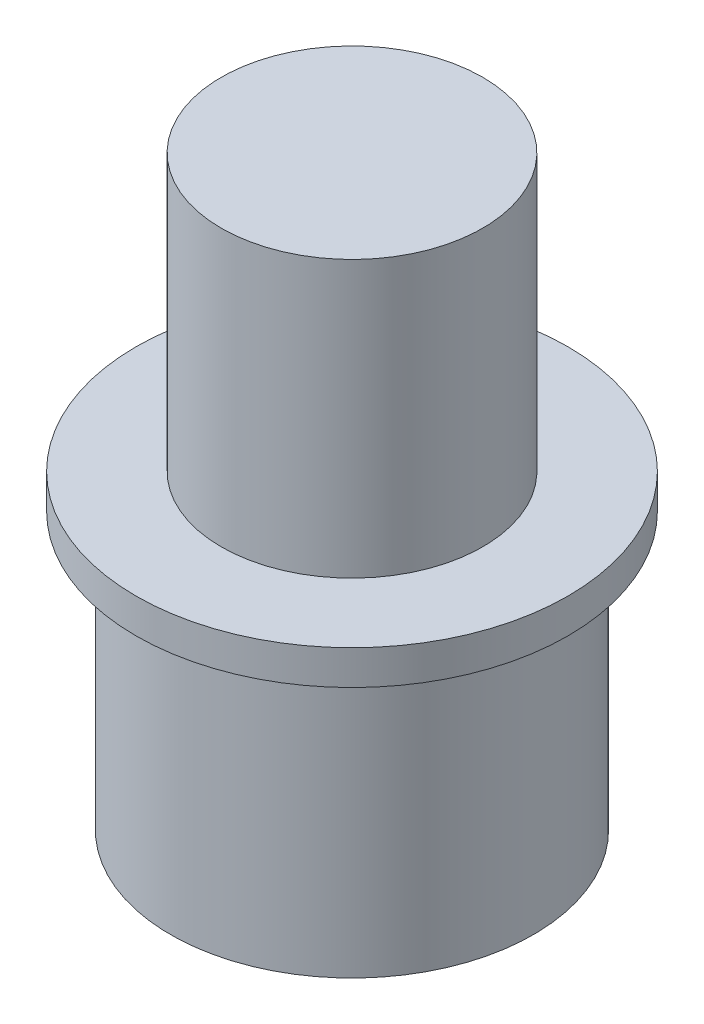
ISO-10303-21;
HEADER;
FILE_DESCRIPTION(('STEP AP214'),'2;1');
FILE_NAME('part.step','',(''),(''),'','','');
FILE_SCHEMA(('AUTOMOTIVE_DESIGN { 1 0 10303 214 1 1 1 1 }'));
ENDSEC;
DATA;
#1=APPLICATION_CONTEXT('core data for automotive mechanical design processes');
#2=APPLICATION_PROTOCOL_DEFINITION('international standard','automotive_design',2000,#1);
#3=PRODUCT_CONTEXT('',#1,'mechanical');
#4=PRODUCT('Part','Part','',(#3));
#5=PRODUCT_RELATED_PRODUCT_CATEGORY('part','',(#4));
#6=PRODUCT_DEFINITION_FORMATION('','',#4);
#7=PRODUCT_DEFINITION_CONTEXT('part definition',#1,'design');
#8=PRODUCT_DEFINITION('design','',#6,#7);
#9=PRODUCT_DEFINITION_SHAPE('','',#8);
#10=(LENGTH_UNIT() NAMED_UNIT(*) SI_UNIT(.MILLI.,.METRE.));
#11=(NAMED_UNIT(*) PLANE_ANGLE_UNIT() SI_UNIT($,.RADIAN.));
#12=(NAMED_UNIT(*) SI_UNIT($,.STERADIAN.) SOLID_ANGLE_UNIT());
#13=UNCERTAINTY_MEASURE_WITH_UNIT(LENGTH_MEASURE(1.E-05),#10,'distance_accuracy_value','');
#14=(GEOMETRIC_REPRESENTATION_CONTEXT(3) GLOBAL_UNCERTAINTY_ASSIGNED_CONTEXT((#13)) GLOBAL_UNIT_ASSIGNED_CONTEXT((#10,
#11,#12)) REPRESENTATION_CONTEXT('',''));
#15=CARTESIAN_POINT('',(0.,0.,0.));
#16=DIRECTION('',(0.,0.,1.));
#17=DIRECTION('',(1.,0.,0.));
#18=AXIS2_PLACEMENT_3D('',#15,#16,#17);
#19=CARTESIAN_POINT('',(0.,0.,0.));
#20=DIRECTION('',(0.,-1.,0.));
#21=DIRECTION('',(0.,0.,-1.));
#22=AXIS2_PLACEMENT_3D('',#19,#20,#21);
#23=CYLINDRICAL_SURFACE('',#22,3.175);
#24=CARTESIAN_POINT('',(0.,8.89,0.));
#25=DIRECTION('',(0.,-1.,0.));
#26=DIRECTION('',(0.,0.,-1.));
#27=AXIS2_PLACEMENT_3D('',#24,#25,#26);
#28=CIRCLE('',#27,3.175);
#29=CARTESIAN_POINT('',(0.,8.89,-3.175));
#30=VERTEX_POINT('',#29);
#31=EDGE_CURVE('E65',#30,#30,#28,.T.);
#32=ORIENTED_EDGE('',*,*,#31,.F.);
#33=EDGE_LOOP('',(#32));
#34=FACE_BOUND('',#33,.T.);
#35=CARTESIAN_POINT('',(0.,0.,0.));
#36=DIRECTION('',(0.,-1.,0.));
#37=DIRECTION('',(0.,0.,-1.));
#38=AXIS2_PLACEMENT_3D('',#35,#36,#37);
#39=CIRCLE('',#38,3.175);
#40=CARTESIAN_POINT('',(0.,0.,-3.175));
#41=VERTEX_POINT('',#40);
#42=EDGE_CURVE('E10',#41,#41,#39,.T.);
#43=ORIENTED_EDGE('',*,*,#42,.T.);
#44=EDGE_LOOP('',(#43));
#45=FACE_BOUND('',#44,.T.);
#46=ADVANCED_FACE('F37',(#34,#45),#23,.F.);
#47=CARTESIAN_POINT('',(0.,0.,0.));
#48=DIRECTION('',(0.,-1.,0.));
#49=DIRECTION('',(0.,0.,-1.));
#50=AXIS2_PLACEMENT_3D('',#47,#48,#49);
#51=PLANE('',#50);
#52=CARTESIAN_POINT('',(0.,0.,0.));
#53=DIRECTION('',(0.,-1.,0.));
#54=DIRECTION('',(0.,0.,-1.));
#55=AXIS2_PLACEMENT_3D('',#52,#53,#54);
#56=CIRCLE('',#55,6.6802);
#57=CARTESIAN_POINT('',(0.,0.,-6.6802));
#58=VERTEX_POINT('',#57);
#59=EDGE_CURVE('E43',#58,#58,#56,.T.);
#60=ORIENTED_EDGE('',*,*,#59,.T.);
#61=EDGE_LOOP('',(#60));
#62=FACE_BOUND('',#61,.T.);
#63=ORIENTED_EDGE('',*,*,#42,.F.);
#64=EDGE_LOOP('',(#63));
#65=FACE_BOUND('',#64,.T.);
#66=ADVANCED_FACE('F72',(#62,#65),#51,.T.);
#67=CARTESIAN_POINT('',(0.,0.,0.));
#68=DIRECTION('',(0.,-1.,0.));
#69=DIRECTION('',(0.,0.,-1.));
#70=AXIS2_PLACEMENT_3D('',#67,#68,#69);
#71=CYLINDRICAL_SURFACE('',#70,6.6802);
#72=CARTESIAN_POINT('',(0.,10.16,0.));
#73=DIRECTION('',(0.,-1.,0.));
#74=DIRECTION('',(0.,0.,-1.));
#75=AXIS2_PLACEMENT_3D('',#72,#73,#74);
#76=CIRCLE('',#75,6.6802);
#77=CARTESIAN_POINT('',(0.,10.16,-6.6802));
#78=VERTEX_POINT('',#77);
#79=EDGE_CURVE('E47',#78,#78,#76,.T.);
#80=ORIENTED_EDGE('',*,*,#79,.T.);
#81=EDGE_LOOP('',(#80));
#82=FACE_BOUND('',#81,.T.);
#83=ORIENTED_EDGE('',*,*,#59,.F.);
#84=EDGE_LOOP('',(#83));
#85=FACE_BOUND('',#84,.T.);
#86=ADVANCED_FACE('F76',(#82,#85),#71,.T.);
#87=CARTESIAN_POINT('',(0.,10.16,0.));
#88=DIRECTION('',(0.,-1.,0.));
#89=DIRECTION('',(0.,0.,-1.));
#90=AXIS2_PLACEMENT_3D('',#87,#88,#89);
#91=PLANE('',#90);
#92=CARTESIAN_POINT('',(0.,10.16,0.));
#93=DIRECTION('',(0.,-1.,0.));
#94=DIRECTION('',(0.,0.,-1.));
#95=AXIS2_PLACEMENT_3D('',#92,#93,#94);
#96=CIRCLE('',#95,7.9502);
#97=CARTESIAN_POINT('',(0.,10.16,-7.9502));
#98=VERTEX_POINT('',#97);
#99=EDGE_CURVE('E51',#98,#98,#96,.T.);
#100=ORIENTED_EDGE('',*,*,#99,.T.);
#101=EDGE_LOOP('',(#100));
#102=FACE_BOUND('',#101,.T.);
#103=ORIENTED_EDGE('',*,*,#79,.F.);
#104=EDGE_LOOP('',(#103));
#105=FACE_BOUND('',#104,.T.);
#106=ADVANCED_FACE('F80',(#102,#105),#91,.T.);
#107=CARTESIAN_POINT('',(0.,0.,0.));
#108=DIRECTION('',(0.,-1.,0.));
#109=DIRECTION('',(0.,0.,-1.));
#110=AXIS2_PLACEMENT_3D('',#107,#108,#109);
#111=CYLINDRICAL_SURFACE('',#110,7.9502);
#112=CARTESIAN_POINT('',(0.,11.43,0.));
#113=DIRECTION('',(0.,-1.,0.));
#114=DIRECTION('',(0.,0.,-1.));
#115=AXIS2_PLACEMENT_3D('',#112,#113,#114);
#116=CIRCLE('',#115,7.9502);
#117=CARTESIAN_POINT('',(0.,11.43,-7.9502));
#118=VERTEX_POINT('',#117);
#119=EDGE_CURVE('E56',#118,#118,#116,.T.);
#120=ORIENTED_EDGE('',*,*,#119,.T.);
#121=EDGE_LOOP('',(#120));
#122=FACE_BOUND('',#121,.T.);
#123=ORIENTED_EDGE('',*,*,#99,.F.);
#124=EDGE_LOOP('',(#123));
#125=FACE_BOUND('',#124,.T.);
#126=ADVANCED_FACE('F87',(#122,#125),#111,.T.);
#127=CARTESIAN_POINT('',(0.,11.43,0.));
#128=DIRECTION('',(0.,-1.,0.));
#129=DIRECTION('',(0.,0.,-1.));
#130=AXIS2_PLACEMENT_3D('',#127,#128,#129);
#131=PLANE('',#130);
#132=ORIENTED_EDGE('',*,*,#119,.F.);
#133=EDGE_LOOP('',(#132));
#134=FACE_BOUND('',#133,.T.);
#135=CARTESIAN_POINT('',(0.,11.43,0.));
#136=DIRECTION('',(0.,-1.,0.));
#137=DIRECTION('',(0.,0.,-1.));
#138=AXIS2_PLACEMENT_3D('',#135,#136,#137);
#139=CIRCLE('',#138,4.8133);
#140=CARTESIAN_POINT('',(0.,11.43,-4.8133));
#141=VERTEX_POINT('',#140);
#142=EDGE_CURVE('E59',#141,#141,#139,.T.);
#143=ORIENTED_EDGE('',*,*,#142,.T.);
#144=EDGE_LOOP('',(#143));
#145=FACE_BOUND('',#144,.T.);
#146=ADVANCED_FACE('F91',(#134,#145),#131,.F.);
#147=CARTESIAN_POINT('',(0.,0.,0.));
#148=DIRECTION('',(0.,-1.,0.));
#149=DIRECTION('',(0.,0.,-1.));
#150=AXIS2_PLACEMENT_3D('',#147,#148,#149);
#151=CYLINDRICAL_SURFACE('',#150,4.8133);
#152=CARTESIAN_POINT('',(0.,21.59,0.));
#153=DIRECTION('',(0.,-1.,0.));
#154=DIRECTION('',(0.,0.,-1.));
#155=AXIS2_PLACEMENT_3D('',#152,#153,#154);
#156=CIRCLE('',#155,4.8133);
#157=CARTESIAN_POINT('',(0.,21.59,-4.8133));
#158=VERTEX_POINT('',#157);
#159=EDGE_CURVE('E62',#158,#158,#156,.T.);
#160=ORIENTED_EDGE('',*,*,#159,.T.);
#161=EDGE_LOOP('',(#160));
#162=FACE_BOUND('',#161,.T.);
#163=ORIENTED_EDGE('',*,*,#142,.F.);
#164=EDGE_LOOP('',(#163));
#165=FACE_BOUND('',#164,.T.);
#166=ADVANCED_FACE('F95',(#162,#165),#151,.T.);
#167=CARTESIAN_POINT('',(0.,21.59,0.));
#168=DIRECTION('',(0.,1.,0.));
#169=DIRECTION('',(0.,0.,1.));
#170=AXIS2_PLACEMENT_3D('',#167,#168,#169);
#171=PLANE('',#170);
#172=ORIENTED_EDGE('',*,*,#159,.F.);
#173=EDGE_LOOP('',(#172));
#174=FACE_BOUND('',#173,.T.);
#175=ADVANCED_FACE('F99',(#174),#171,.T.);
#176=CARTESIAN_POINT('',(0.,8.89,0.));
#177=DIRECTION('',(0.,-1.,0.));
#178=DIRECTION('',(0.,0.,-1.));
#179=AXIS2_PLACEMENT_3D('',#176,#177,#178);
#180=PLANE('',#179);
#181=ORIENTED_EDGE('',*,*,#31,.T.);
#182=EDGE_LOOP('',(#181));
#183=FACE_BOUND('',#182,.T.);
#184=ADVANCED_FACE('F69',(#183),#180,.T.);
#185=CLOSED_SHELL('',(#46,#66,#86,#106,#126,#146,#166,#175,#184));
#186=MANIFOLD_SOLID_BREP('B2',#185);
#187=ADVANCED_BREP_SHAPE_REPRESENTATION('',(#18,#186),#14);
#188=SHAPE_DEFINITION_REPRESENTATION(#9,#187);
ENDSEC;
END-ISO-10303-21;
